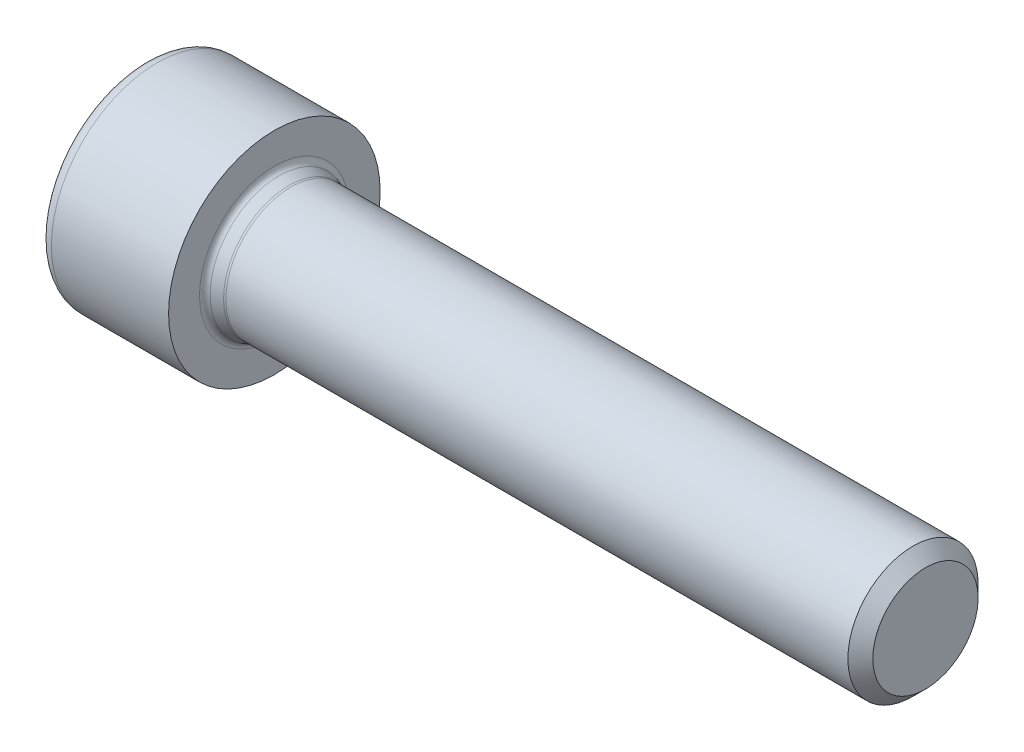
ISO-10303-21;
HEADER;
FILE_DESCRIPTION(('STEP AP214'),'2;1');
FILE_NAME('part.step','',(''),(''),'','','');
FILE_SCHEMA(('AUTOMOTIVE_DESIGN { 1 0 10303 214 1 1 1 1 }'));
ENDSEC;
DATA;
#1=APPLICATION_CONTEXT('core data for automotive mechanical design processes');
#2=APPLICATION_PROTOCOL_DEFINITION('international standard','automotive_design',2000,#1);
#3=PRODUCT_CONTEXT('',#1,'mechanical');
#4=PRODUCT('Part','Part','',(#3));
#5=PRODUCT_RELATED_PRODUCT_CATEGORY('part','',(#4));
#6=PRODUCT_DEFINITION_FORMATION('','',#4);
#7=PRODUCT_DEFINITION_CONTEXT('part definition',#1,'design');
#8=PRODUCT_DEFINITION('design','',#6,#7);
#9=PRODUCT_DEFINITION_SHAPE('','',#8);
#10=(LENGTH_UNIT() NAMED_UNIT(*) SI_UNIT(.MILLI.,.METRE.));
#11=(NAMED_UNIT(*) PLANE_ANGLE_UNIT() SI_UNIT($,.RADIAN.));
#12=(NAMED_UNIT(*) SI_UNIT($,.STERADIAN.) SOLID_ANGLE_UNIT());
#13=UNCERTAINTY_MEASURE_WITH_UNIT(LENGTH_MEASURE(1.E-05),#10,'distance_accuracy_value','');
#14=(GEOMETRIC_REPRESENTATION_CONTEXT(3) GLOBAL_UNCERTAINTY_ASSIGNED_CONTEXT((#13)) GLOBAL_UNIT_ASSIGNED_CONTEXT((#10,
#11,#12)) REPRESENTATION_CONTEXT('',''));
#15=CARTESIAN_POINT('',(0.,0.,0.));
#16=DIRECTION('',(0.,0.,1.));
#17=DIRECTION('',(1.,0.,0.));
#18=AXIS2_PLACEMENT_3D('',#15,#16,#17);
#19=CARTESIAN_POINT('',(-8.,0.,0.));
#20=DIRECTION('',(-1.,0.,0.));
#21=DIRECTION('',(0.,0.,1.));
#22=AXIS2_PLACEMENT_3D('',#19,#20,#21);
#23=CONICAL_SURFACE('',#22,3.43,0.785398163397448);
#24=CARTESIAN_POINT('',(-8.,0.,0.));
#25=DIRECTION('',(-1.,0.,0.));
#26=DIRECTION('',(0.,0.,1.));
#27=AXIS2_PLACEMENT_3D('',#24,#25,#26);
#28=CIRCLE('',#27,3.43);
#29=CARTESIAN_POINT('',(-8.,1.76667678869294,2.9400260414312));
#30=VERTEX_POINT('',#29);
#31=CARTESIAN_POINT('',(-8.,3.42947563401369,0.0599739585688037));
#32=VERTEX_POINT('',#31);
#33=EDGE_CURVE('E328',#30,#32,#28,.T.);
#34=ORIENTED_EDGE('',*,*,#33,.T.);
#35=CARTESIAN_POINT('',(-8.0002,3.42968189315209,0.0596167072615685));
#36=CARTESIAN_POINT('',(-7.94445128948551,3.37215218133699,0.15926109107012));
#37=CARTESIAN_POINT('',(-7.89213548301643,3.31368119222506,0.260535814980778));
#38=CARTESIAN_POINT('',(-7.79663457233289,3.19456786062131,0.466846157177285));
#39=CARTESIAN_POINT('',(-7.75349819621619,3.13391583501754,0.571898547104982));
#40=CARTESIAN_POINT('',(-7.67978878966847,3.01163972086899,0.783686989362354));
#41=CARTESIAN_POINT('',(-7.64904294578292,2.95004241041424,0.890376660679582));
#42=CARTESIAN_POINT('',(-7.60186435236538,2.82559002013651,1.105934523764));
#43=CARTESIAN_POINT('',(-7.58539977047203,2.76273805870714,1.21479731431503));
#44=CARTESIAN_POINT('',(-7.57052751312349,2.65273581108589,1.4053267961418));
#45=CARTESIAN_POINT('',(-7.56856676699692,2.60570135626187,1.48679286160332));
#46=CARTESIAN_POINT('',(-7.57349848669332,2.51173114393863,1.64955404374519));
#47=CARTESIAN_POINT('',(-7.58039393298158,2.46479542499364,1.7308490936477));
#48=CARTESIAN_POINT('',(-7.60264354379,2.37139103727966,1.89263023881816));
#49=CARTESIAN_POINT('',(-7.61800580231539,2.32492285881501,1.97311548485411));
#50=CARTESIAN_POINT('',(-7.65635411917835,2.23279952753145,2.13267777519974));
#51=CARTESIAN_POINT('',(-7.67933950702644,2.18714430358143,2.21175494271212));
#52=CARTESIAN_POINT('',(-7.74328762165329,2.07723451377933,2.40212428289857));
#53=CARTESIAN_POINT('',(-7.78772517421062,2.01348470492451,2.51254219080792));
#54=CARTESIAN_POINT('',(-7.86214107755692,1.91956856997231,2.67520970819563));
#55=CARTESIAN_POINT('',(-7.88819484196703,1.88859307705884,2.72886083571124));
#56=CARTESIAN_POINT('',(-7.94257244755195,1.82715678787997,2.83527160999755));
#57=CARTESIAN_POINT('',(-7.97089545456634,1.79669580742314,2.88803157579714));
#58=CARTESIAN_POINT('',(-8.00020000000014,1.7664705295544,2.94038329273868));
#59=B_SPLINE_CURVE_WITH_KNOTS('',3,(#35,#36,#37,#38,#39,#40,#41,#42,#43,#44,#45,#46,#47,#48,#49,
#50,#51,#52,#53,#54,#55,#56,#57,#58),.UNSPECIFIED.,.F.,.F.,(4,2,2,2,2,2,2,2,2,2,2,4),(0.,
0.383803741338895,0.76959666933732,1.14980534011032,1.52916434701811,1.81103145456679,
2.09299344660598,2.37522545412114,2.6574326446067,3.06181424627924,3.26340207903656,
3.4649161462977),.UNSPECIFIED.);
#60=EDGE_CURVE('E293',#32,#30,#59,.T.);
#61=ORIENTED_EDGE('',*,*,#60,.T.);
#62=EDGE_LOOP('',(#34,#61));
#63=FACE_BOUND('',#62,.T.);
#64=ADVANCED_FACE('F83',(#63),#23,.F.);
#65=CARTESIAN_POINT('',(-8.,3.42947563401369,-0.0599739585688038));
#66=VERTEX_POINT('',#65);
#67=CARTESIAN_POINT('',(-8.,1.76667678869294,-2.9400260414312));
#68=VERTEX_POINT('',#67);
#69=EDGE_CURVE('E331',#66,#68,#28,.T.);
#70=ORIENTED_EDGE('',*,*,#69,.T.);
#71=CARTESIAN_POINT('',(-8.00020000000014,1.7664705295544,-2.94038329273868));
#72=CARTESIAN_POINT('',(-7.94445128948564,1.82400024136951,-2.84073890893012));
#73=CARTESIAN_POINT('',(-7.89213548301654,1.88247123048144,-2.73946418501945));
#74=CARTESIAN_POINT('',(-7.79663457233298,2.00158456208521,-2.53315384282291));
#75=CARTESIAN_POINT('',(-7.75349819621626,2.06223658768899,-2.4281014528952));
#76=CARTESIAN_POINT('',(-7.67978878966851,2.18451270183755,-2.21631301063779));
#77=CARTESIAN_POINT('',(-7.64904294578296,2.24611001229232,-2.10962333932055));
#78=CARTESIAN_POINT('',(-7.6018643523654,2.37056240257007,-1.8940654762361));
#79=CARTESIAN_POINT('',(-7.58539977047204,2.43341436399945,-1.78520268568504));
#80=CARTESIAN_POINT('',(-7.5705275131235,2.54341661162071,-1.59467320385826));
#81=CARTESIAN_POINT('',(-7.56856676699693,2.59045106644473,-1.51320713839674));
#82=CARTESIAN_POINT('',(-7.57349848669331,2.68442127876797,-1.35044595625486));
#83=CARTESIAN_POINT('',(-7.58039393298157,2.73135699771296,-1.26915090635236));
#84=CARTESIAN_POINT('',(-7.60264354378999,2.82476138542694,-1.10736976118189));
#85=CARTESIAN_POINT('',(-7.61800580231538,2.87122956389159,-1.02688451514594));
#86=CARTESIAN_POINT('',(-7.65635411917833,2.96335289517515,-0.867322224800316));
#87=CARTESIAN_POINT('',(-7.67933950702642,3.00900811912518,-0.788245057287929));
#88=CARTESIAN_POINT('',(-7.74328762165326,3.11891790892725,-0.597875717101519));
#89=CARTESIAN_POINT('',(-7.78772517421057,3.18266771778205,-0.487457809192203));
#90=CARTESIAN_POINT('',(-7.86214107755684,3.27658385273422,-0.324790291804544));
#91=CARTESIAN_POINT('',(-7.88819484196693,3.30755934564768,-0.271139164288945));
#92=CARTESIAN_POINT('',(-7.94257244755183,3.36899563482654,-0.164728390002673));
#93=CARTESIAN_POINT('',(-7.97089545456621,3.39945661528336,-0.111968424203101));
#94=CARTESIAN_POINT('',(-8.0002,3.42968189315209,-0.0596167072615678));
#95=B_SPLINE_CURVE_WITH_KNOTS('',3,(#71,#72,#73,#74,#75,#76,#77,#78,#79,#80,#81,#82,#83,#84,#85,
#86,#87,#88,#89,#90,#91,#92,#93,#94),.UNSPECIFIED.,.F.,.F.,(4,2,2,2,2,2,2,2,2,2,2,4),(0.,
0.383803741338958,0.769596669337447,1.14980534011051,1.52916434701837,1.81103145456705,
2.09299344660624,2.3752254541214,2.65743264460696,3.06181424627937,3.26340207903663,
3.4649161462977),.UNSPECIFIED.);
#96=EDGE_CURVE('E288',#68,#66,#95,.T.);
#97=ORIENTED_EDGE('',*,*,#96,.T.);
#98=EDGE_LOOP('',(#70,#97));
#99=FACE_BOUND('',#98,.T.);
#100=ADVANCED_FACE('F319',(#99),#23,.F.);
#101=CARTESIAN_POINT('',(-8.,1.66279884532074,-3.));
#102=VERTEX_POINT('',#101);
#103=CARTESIAN_POINT('',(-8.,-1.66279884532074,-3.));
#104=VERTEX_POINT('',#103);
#105=EDGE_CURVE('E337',#102,#104,#28,.T.);
#106=ORIENTED_EDGE('',*,*,#105,.T.);
#107=CARTESIAN_POINT('',(-9.25683811666746,-3.60089593460391,-3.));
#108=CARTESIAN_POINT('',(-9.1899732652069,-3.5138467089695,-3.));
#109=CARTESIAN_POINT('',(-9.12371141227149,-3.42632688663059,-3.));
#110=CARTESIAN_POINT('',(-8.99266873176537,-3.25015426104585,-3.));
#111=CARTESIAN_POINT('',(-8.927888260097,-3.16150119334976,-3.));
#112=CARTESIAN_POINT('',(-8.79962232822234,-2.98222228828942,-3.));
#113=CARTESIAN_POINT('',(-8.73615072321782,-2.89158650554003,-3.));
#114=CARTESIAN_POINT('',(-8.61142942118204,-2.70880382260059,-3.));
#115=CARTESIAN_POINT('',(-8.55017957085525,-2.61665702730612,-3.));
#116=CARTESIAN_POINT('',(-8.42664191933515,-2.42475066596851,-3.));
#117=CARTESIAN_POINT('',(-8.3645309420549,-2.32487669679929,-3.));
#118=CARTESIAN_POINT('',(-8.24418302483278,-2.12278429752024,-3.));
#119=CARTESIAN_POINT('',(-8.18594673363496,-2.02056547864257,-3.));
#120=CARTESIAN_POINT('',(-8.07458982868164,-1.81375858148893,-3.));
#121=CARTESIAN_POINT('',(-8.02145419400034,-1.70917865511472,-3.));
#122=CARTESIAN_POINT('',(-7.92148904242748,-1.4970709738416,-3.));
#123=CARTESIAN_POINT('',(-7.8746565605369,-1.38954463378653,-3.));
#124=CARTESIAN_POINT('',(-7.79315666520408,-1.18192230353124,-3.));
#125=CARTESIAN_POINT('',(-7.75774932375754,-1.08211975122954,-3.));
#126=CARTESIAN_POINT('',(-7.69492443851392,-0.879983721132287,-3.));
#127=CARTESIAN_POINT('',(-7.66750740683301,-0.777650081569711,-3.));
#128=CARTESIAN_POINT('',(-7.62259948527455,-0.572838321795489,-3.));
#129=CARTESIAN_POINT('',(-7.60492919530609,-0.470400208079424,-3.));
#130=CARTESIAN_POINT('',(-7.579881374429,-0.264266267330525,-3.));
#131=CARTESIAN_POINT('',(-7.57250174135376,-0.160570701535941,-3.));
#132=CARTESIAN_POINT('',(-7.56865707718844,0.0425589692299217,-3.));
#133=CARTESIAN_POINT('',(-7.57173626178567,0.141984537989483,-3.));
#134=CARTESIAN_POINT('',(-7.58759599253369,0.340053623390843,-3.));
#135=CARTESIAN_POINT('',(-7.60037742551248,0.438697067710168,-3.));
#136=CARTESIAN_POINT('',(-7.63513837273016,0.636159304889223,-3.));
#137=CARTESIAN_POINT('',(-7.65727977296236,0.734949114878743,-3.));
#138=CARTESIAN_POINT('',(-7.70953635508266,0.930355391005281,-3.));
#139=CARTESIAN_POINT('',(-7.73965106524348,1.02697198535012,-3.));
#140=CARTESIAN_POINT('',(-7.8085615039976,1.22363203683084,-3.));
#141=CARTESIAN_POINT('',(-7.84777278223078,1.32352823240013,-3.));
#142=CARTESIAN_POINT('',(-7.93224534094475,1.52073629110562,-3.));
#143=CARTESIAN_POINT('',(-7.97750856914324,1.61804731011014,-3.));
#144=CARTESIAN_POINT('',(-8.07301916941846,1.81056665192493,-3.));
#145=CARTESIAN_POINT('',(-8.12328227557948,1.90576710512834,-3.));
#146=CARTESIAN_POINT('',(-8.22768211012451,2.09398380875647,-3.));
#147=CARTESIAN_POINT('',(-8.28181815601638,2.18700044019744,-3.));
#148=CARTESIAN_POINT('',(-8.39045717895091,2.36658990741689,-3.));
#149=CARTESIAN_POINT('',(-8.44480995173043,2.45325408876517,-3.));
#150=CARTESIAN_POINT('',(-8.55582709985423,2.6250935615464,-3.));
#151=CARTESIAN_POINT('',(-8.6124916486565,2.71026874056854,-3.));
#152=CARTESIAN_POINT('',(-8.72725822960812,2.87863975740492,-3.));
#153=CARTESIAN_POINT('',(-8.78534505080608,2.96184600084624,-3.));
#154=CARTESIAN_POINT('',(-8.9030743415102,3.12711730435875,-3.));
#155=CARTESIAN_POINT('',(-8.9627163778154,3.20918267265618,-3.));
#156=CARTESIAN_POINT('',(-9.0229949516808,3.29076952090156,-3.));
#157=B_SPLINE_CURVE_WITH_KNOTS('',3,(#107,#108,#109,#110,#111,#112,#113,#114,#115,#116,#117,
#118,#119,#120,#121,#122,#123,#124,#125,#126,#127,#128,#129,#130,#131,#132,#133,#134,#135,#136,
#137,#138,#139,#140,#141,#142,#143,#144,#145,#146,#147,#148,#149,#150,#151,#152,#153,#154,#155,
#156),.UNSPECIFIED.,.F.,.F.,(4,2,2,2,2,2,2,2,2,2,2,2,2,2,2,2,2,2,2,2,2,2,2,2,4),(0.,
0.329302731842327,0.658683764795409,0.99060717455276,1.32250763869058,1.67527376182026,
2.02809880120335,2.37985069947165,2.73143655121112,3.04885409798105,3.36629198425407,
3.67767349965861,3.98899139699043,4.28691955486206,4.58487494795206,4.8882092833539,
5.19152567650533,5.51322738298347,5.83503287404874,6.15788517368226,6.48068071953801,
6.78753206182661,7.09440647038974,7.39881482419977,7.70313927304357),.UNSPECIFIED.);
#158=EDGE_CURVE('E282',#104,#102,#157,.T.);
#159=ORIENTED_EDGE('',*,*,#158,.T.);
#160=EDGE_LOOP('',(#106,#159));
#161=FACE_BOUND('',#160,.T.);
#162=ADVANCED_FACE('F324',(#161),#23,.F.);
#163=CARTESIAN_POINT('',(-8.,-1.76667678869294,-2.9400260414312));
#164=VERTEX_POINT('',#163);
#165=CARTESIAN_POINT('',(-8.,-3.42947563401369,-0.0599739585688037));
#166=VERTEX_POINT('',#165);
#167=EDGE_CURVE('E344',#164,#166,#28,.T.);
#168=ORIENTED_EDGE('',*,*,#167,.T.);
#169=CARTESIAN_POINT('',(-8.0002,-3.42968189315209,-0.0596167072615685));
#170=CARTESIAN_POINT('',(-7.94445128948551,-3.37215218133699,-0.15926109107012));
#171=CARTESIAN_POINT('',(-7.89213548301643,-3.31368119222506,-0.260535814980778));
#172=CARTESIAN_POINT('',(-7.79663457233289,-3.19456786062131,-0.466846157177285));
#173=CARTESIAN_POINT('',(-7.75349819621619,-3.13391583501754,-0.571898547104982));
#174=CARTESIAN_POINT('',(-7.67978878966847,-3.01163972086899,-0.783686989362354));
#175=CARTESIAN_POINT('',(-7.64904294578292,-2.95004241041424,-0.890376660679582));
#176=CARTESIAN_POINT('',(-7.60186435236538,-2.82559002013651,-1.105934523764));
#177=CARTESIAN_POINT('',(-7.58539977047203,-2.76273805870714,-1.21479731431503));
#178=CARTESIAN_POINT('',(-7.57052751312349,-2.65273581108589,-1.4053267961418));
#179=CARTESIAN_POINT('',(-7.56856676699692,-2.60570135626187,-1.48679286160332));
#180=CARTESIAN_POINT('',(-7.57349848669332,-2.51173114393863,-1.64955404374519));
#181=CARTESIAN_POINT('',(-7.58039393298158,-2.46479542499364,-1.7308490936477));
#182=CARTESIAN_POINT('',(-7.60264354379,-2.37139103727966,-1.89263023881816));
#183=CARTESIAN_POINT('',(-7.61800580231539,-2.32492285881501,-1.97311548485411));
#184=CARTESIAN_POINT('',(-7.65635411917835,-2.23279952753145,-2.13267777519974));
#185=CARTESIAN_POINT('',(-7.67933950702644,-2.18714430358143,-2.21175494271212));
#186=CARTESIAN_POINT('',(-7.74328762165329,-2.07723451377933,-2.40212428289857));
#187=CARTESIAN_POINT('',(-7.78772517421062,-2.01348470492451,-2.51254219080792));
#188=CARTESIAN_POINT('',(-7.86214107755692,-1.91956856997231,-2.67520970819563));
#189=CARTESIAN_POINT('',(-7.88819484196703,-1.88859307705884,-2.72886083571124));
#190=CARTESIAN_POINT('',(-7.94257244755195,-1.82715678787997,-2.83527160999755));
#191=CARTESIAN_POINT('',(-7.97089545456634,-1.79669580742314,-2.88803157579714));
#192=CARTESIAN_POINT('',(-8.00020000000014,-1.7664705295544,-2.94038329273868));
#193=B_SPLINE_CURVE_WITH_KNOTS('',3,(#169,#170,#171,#172,#173,#174,#175,#176,#177,#178,#179,
#180,#181,#182,#183,#184,#185,#186,#187,#188,#189,#190,#191,#192),.UNSPECIFIED.,.F.,.F.,(4,2,2,
2,2,2,2,2,2,2,2,4),(0.,0.383803741338895,0.76959666933732,1.14980534011032,1.52916434701811,
1.81103145456679,2.09299344660598,2.37522545412114,2.6574326446067,3.06181424627924,
3.26340207903656,3.4649161462977),.UNSPECIFIED.);
#194=EDGE_CURVE('E276',#166,#164,#193,.T.);
#195=ORIENTED_EDGE('',*,*,#194,.T.);
#196=EDGE_LOOP('',(#168,#195));
#197=FACE_BOUND('',#196,.T.);
#198=ADVANCED_FACE('F511',(#197),#23,.F.);
#199=CARTESIAN_POINT('',(-8.,-3.42947563401369,0.0599739585688032));
#200=VERTEX_POINT('',#199);
#201=CARTESIAN_POINT('',(-8.,-1.76667678869294,2.9400260414312));
#202=VERTEX_POINT('',#201);
#203=EDGE_CURVE('E340',#200,#202,#28,.T.);
#204=ORIENTED_EDGE('',*,*,#203,.T.);
#205=CARTESIAN_POINT('',(-8.00020000000014,-1.7664705295544,2.94038329273868));
#206=CARTESIAN_POINT('',(-7.94445128948564,-1.82400024136951,2.84073890893012));
#207=CARTESIAN_POINT('',(-7.89213548301654,-1.88247123048144,2.73946418501945));
#208=CARTESIAN_POINT('',(-7.79663457233298,-2.00158456208521,2.53315384282291));
#209=CARTESIAN_POINT('',(-7.75349819621626,-2.06223658768899,2.4281014528952));
#210=CARTESIAN_POINT('',(-7.67978878966851,-2.18451270183755,2.21631301063779));
#211=CARTESIAN_POINT('',(-7.64904294578296,-2.24611001229232,2.10962333932055));
#212=CARTESIAN_POINT('',(-7.6018643523654,-2.37056240257007,1.8940654762361));
#213=CARTESIAN_POINT('',(-7.58539977047204,-2.43341436399945,1.78520268568504));
#214=CARTESIAN_POINT('',(-7.5705275131235,-2.54341661162071,1.59467320385826));
#215=CARTESIAN_POINT('',(-7.56856676699693,-2.59045106644473,1.51320713839674));
#216=CARTESIAN_POINT('',(-7.57349848669331,-2.68442127876797,1.35044595625486));
#217=CARTESIAN_POINT('',(-7.58039393298157,-2.73135699771296,1.26915090635236));
#218=CARTESIAN_POINT('',(-7.60264354378999,-2.82476138542694,1.10736976118189));
#219=CARTESIAN_POINT('',(-7.61800580231538,-2.87122956389159,1.02688451514594));
#220=CARTESIAN_POINT('',(-7.65635411917833,-2.96335289517515,0.867322224800316));
#221=CARTESIAN_POINT('',(-7.67933950702642,-3.00900811912518,0.788245057287929));
#222=CARTESIAN_POINT('',(-7.74328762165326,-3.11891790892725,0.597875717101519));
#223=CARTESIAN_POINT('',(-7.78772517421057,-3.18266771778205,0.487457809192203));
#224=CARTESIAN_POINT('',(-7.86214107755684,-3.27658385273422,0.324790291804544));
#225=CARTESIAN_POINT('',(-7.88819484196693,-3.30755934564768,0.271139164288945));
#226=CARTESIAN_POINT('',(-7.94257244755183,-3.36899563482654,0.164728390002673));
#227=CARTESIAN_POINT('',(-7.97089545456621,-3.39945661528336,0.111968424203101));
#228=CARTESIAN_POINT('',(-8.0002,-3.42968189315209,0.0596167072615678));
#229=B_SPLINE_CURVE_WITH_KNOTS('',3,(#205,#206,#207,#208,#209,#210,#211,#212,#213,#214,#215,
#216,#217,#218,#219,#220,#221,#222,#223,#224,#225,#226,#227,#228),.UNSPECIFIED.,.F.,.F.,(4,2,2,
2,2,2,2,2,2,2,2,4),(0.,0.383803741338958,0.769596669337447,1.14980534011051,1.52916434701837,
1.81103145456705,2.09299344660624,2.3752254541214,2.65743264460696,3.06181424627937,
3.26340207903663,3.4649161462977),.UNSPECIFIED.);
#230=EDGE_CURVE('E254',#202,#200,#229,.T.);
#231=ORIENTED_EDGE('',*,*,#230,.T.);
#232=EDGE_LOOP('',(#204,#231));
#233=FACE_BOUND('',#232,.T.);
#234=ADVANCED_FACE('F267',(#233),#23,.F.);
#235=CARTESIAN_POINT('',(-8.,-1.66279884532074,3.));
#236=VERTEX_POINT('',#235);
#237=CARTESIAN_POINT('',(-8.,1.66279884532074,3.));
#238=VERTEX_POINT('',#237);
#239=EDGE_CURVE('E333',#236,#238,#28,.T.);
#240=ORIENTED_EDGE('',*,*,#239,.T.);
#241=CARTESIAN_POINT('',(-9.25683811666746,-3.60089593460391,3.));
#242=CARTESIAN_POINT('',(-9.1899732652069,-3.5138467089695,3.));
#243=CARTESIAN_POINT('',(-9.12371141227149,-3.42632688663059,3.));
#244=CARTESIAN_POINT('',(-8.99266873176537,-3.25015426104585,3.));
#245=CARTESIAN_POINT('',(-8.927888260097,-3.16150119334976,3.));
#246=CARTESIAN_POINT('',(-8.79962232822234,-2.98222228828942,3.));
#247=CARTESIAN_POINT('',(-8.73615072321782,-2.89158650554003,3.));
#248=CARTESIAN_POINT('',(-8.61142942118204,-2.70880382260059,3.));
#249=CARTESIAN_POINT('',(-8.55017957085525,-2.61665702730612,3.));
#250=CARTESIAN_POINT('',(-8.42664191933515,-2.42475066596851,3.));
#251=CARTESIAN_POINT('',(-8.3645309420549,-2.32487669679929,3.));
#252=CARTESIAN_POINT('',(-8.24418302483278,-2.12278429752024,3.));
#253=CARTESIAN_POINT('',(-8.18594673363496,-2.02056547864257,3.));
#254=CARTESIAN_POINT('',(-8.07458982868164,-1.81375858148893,3.));
#255=CARTESIAN_POINT('',(-8.02145419400034,-1.70917865511472,3.));
#256=CARTESIAN_POINT('',(-7.92148904242748,-1.4970709738416,3.));
#257=CARTESIAN_POINT('',(-7.8746565605369,-1.38954463378653,3.));
#258=CARTESIAN_POINT('',(-7.79315666520408,-1.18192230353124,3.));
#259=CARTESIAN_POINT('',(-7.75774932375754,-1.08211975122954,3.));
#260=CARTESIAN_POINT('',(-7.69492443851392,-0.879983721132287,3.));
#261=CARTESIAN_POINT('',(-7.66750740683301,-0.777650081569711,3.));
#262=CARTESIAN_POINT('',(-7.62259948527455,-0.572838321795489,3.));
#263=CARTESIAN_POINT('',(-7.60492919530609,-0.470400208079424,3.));
#264=CARTESIAN_POINT('',(-7.579881374429,-0.264266267330525,3.));
#265=CARTESIAN_POINT('',(-7.57250174135376,-0.160570701535941,3.));
#266=CARTESIAN_POINT('',(-7.56865707718844,0.0425589692299217,3.));
#267=CARTESIAN_POINT('',(-7.57173626178567,0.141984537989483,3.));
#268=CARTESIAN_POINT('',(-7.58759599253369,0.340053623390843,3.));
#269=CARTESIAN_POINT('',(-7.60037742551248,0.438697067710168,3.));
#270=CARTESIAN_POINT('',(-7.63513837273016,0.636159304889223,3.));
#271=CARTESIAN_POINT('',(-7.65727977296236,0.734949114878743,3.));
#272=CARTESIAN_POINT('',(-7.70953635508266,0.930355391005281,3.));
#273=CARTESIAN_POINT('',(-7.73965106524348,1.02697198535012,3.));
#274=CARTESIAN_POINT('',(-7.8085615039976,1.22363203683084,3.));
#275=CARTESIAN_POINT('',(-7.84777278223078,1.32352823240013,3.));
#276=CARTESIAN_POINT('',(-7.93224534094475,1.52073629110562,3.));
#277=CARTESIAN_POINT('',(-7.97750856914324,1.61804731011014,3.));
#278=CARTESIAN_POINT('',(-8.07301916941846,1.81056665192493,3.));
#279=CARTESIAN_POINT('',(-8.12328227557948,1.90576710512834,3.));
#280=CARTESIAN_POINT('',(-8.22768211012451,2.09398380875647,3.));
#281=CARTESIAN_POINT('',(-8.28181815601638,2.18700044019744,3.));
#282=CARTESIAN_POINT('',(-8.39045717895091,2.36658990741689,3.));
#283=CARTESIAN_POINT('',(-8.44480995173043,2.45325408876517,3.));
#284=CARTESIAN_POINT('',(-8.55582709985423,2.6250935615464,3.));
#285=CARTESIAN_POINT('',(-8.6124916486565,2.71026874056854,3.));
#286=CARTESIAN_POINT('',(-8.72725822960812,2.87863975740492,3.));
#287=CARTESIAN_POINT('',(-8.78534505080608,2.96184600084624,3.));
#288=CARTESIAN_POINT('',(-8.9030743415102,3.12711730435875,3.));
#289=CARTESIAN_POINT('',(-8.9627163778154,3.20918267265618,3.));
#290=CARTESIAN_POINT('',(-9.0229949516808,3.29076952090156,3.));
#291=B_SPLINE_CURVE_WITH_KNOTS('',3,(#241,#242,#243,#244,#245,#246,#247,#248,#249,#250,#251,
#252,#253,#254,#255,#256,#257,#258,#259,#260,#261,#262,#263,#264,#265,#266,#267,#268,#269,#270,
#271,#272,#273,#274,#275,#276,#277,#278,#279,#280,#281,#282,#283,#284,#285,#286,#287,#288,#289,
#290),.UNSPECIFIED.,.F.,.F.,(4,2,2,2,2,2,2,2,2,2,2,2,2,2,2,2,2,2,2,2,2,2,2,2,4),(0.,
0.329302731842327,0.658683764795409,0.99060717455276,1.32250763869058,1.67527376182026,
2.02809880120335,2.37985069947165,2.73143655121112,3.04885409798105,3.36629198425407,
3.67767349965861,3.98899139699043,4.28691955486206,4.58487494795206,4.8882092833539,
5.19152567650533,5.51322738298347,5.83503287404874,6.15788517368226,6.48068071953801,
6.78753206182661,7.09440647038974,7.39881482419977,7.70313927304357),.UNSPECIFIED.);
#292=EDGE_CURVE('E241',#238,#236,#291,.F.);
#293=ORIENTED_EDGE('',*,*,#292,.T.);
#294=EDGE_LOOP('',(#240,#293));
#295=FACE_BOUND('',#294,.T.);
#296=ADVANCED_FACE('F262',(#295),#23,.F.);
#297=CARTESIAN_POINT('',(-8.,0.,-3.43));
#298=DIRECTION('',(1.,0.,0.));
#299=DIRECTION('',(0.,0.,-1.));
#300=AXIS2_PLACEMENT_3D('',#297,#298,#299);
#301=PLANE('',#300);
#302=DIRECTION('',(0.,0.5,0.866025403784439));
#303=VECTOR('',#302,1.);
#304=CARTESIAN_POINT('',(-8.,1.112842643863,-4.0725));
#305=LINE('',#304,#303);
#306=CARTESIAN_POINT('',(-8.,3.46410161513775,0.));
#307=VERTEX_POINT('',#306);
#308=EDGE_CURVE('E92',#66,#307,#305,.T.);
#309=ORIENTED_EDGE('',*,*,#308,.T.);
#310=DIRECTION('',(0.,-0.5,0.866025403784439));
#311=VECTOR('',#310,1.);
#312=CARTESIAN_POINT('',(-8.,4.08330977884363,-1.0725));
#313=LINE('',#312,#311);
#314=EDGE_CURVE('E47',#307,#32,#313,.T.);
#315=ORIENTED_EDGE('',*,*,#314,.T.);
#316=ORIENTED_EDGE('',*,*,#33,.F.);
#317=CARTESIAN_POINT('',(-8.,1.73205080756888,3.));
#318=VERTEX_POINT('',#317);
#319=EDGE_CURVE('E94',#30,#318,#313,.T.);
#320=ORIENTED_EDGE('',*,*,#319,.T.);
#321=DIRECTION('',(0.,-1.,0.));
#322=VECTOR('',#321,1.);
#323=CARTESIAN_POINT('',(-8.,0.,3.));
#324=LINE('',#323,#322);
#325=EDGE_CURVE('E216',#318,#238,#324,.T.);
#326=ORIENTED_EDGE('',*,*,#325,.T.);
#327=ORIENTED_EDGE('',*,*,#239,.F.);
#328=CARTESIAN_POINT('',(-8.,-1.73205080756888,3.));
#329=VERTEX_POINT('',#328);
#330=EDGE_CURVE('E454',#236,#329,#324,.T.);
#331=ORIENTED_EDGE('',*,*,#330,.T.);
#332=DIRECTION('',(0.,-0.5,-0.866025403784439));
#333=VECTOR('',#332,1.);
#334=CARTESIAN_POINT('',(-8.,-4.08330977884363,-1.0725));
#335=LINE('',#334,#333);
#336=EDGE_CURVE('E451',#329,#202,#335,.T.);
#337=ORIENTED_EDGE('',*,*,#336,.T.);
#338=ORIENTED_EDGE('',*,*,#203,.F.);
#339=CARTESIAN_POINT('',(-8.,-3.46410161513775,0.));
#340=VERTEX_POINT('',#339);
#341=EDGE_CURVE('E449',#200,#340,#335,.T.);
#342=ORIENTED_EDGE('',*,*,#341,.T.);
#343=DIRECTION('',(0.,0.5,-0.866025403784439));
#344=VECTOR('',#343,1.);
#345=CARTESIAN_POINT('',(-8.,-1.112842643863,-4.0725));
#346=LINE('',#345,#344);
#347=EDGE_CURVE('E447',#340,#166,#346,.T.);
#348=ORIENTED_EDGE('',*,*,#347,.T.);
#349=ORIENTED_EDGE('',*,*,#167,.F.);
#350=CARTESIAN_POINT('',(-8.,-1.73205080756888,-3.));
#351=VERTEX_POINT('',#350);
#352=EDGE_CURVE('E445',#164,#351,#346,.T.);
#353=ORIENTED_EDGE('',*,*,#352,.T.);
#354=DIRECTION('',(0.,1.,0.));
#355=VECTOR('',#354,1.);
#356=CARTESIAN_POINT('',(-8.,0.,-3.));
#357=LINE('',#356,#355);
#358=EDGE_CURVE('E441',#351,#104,#357,.T.);
#359=ORIENTED_EDGE('',*,*,#358,.T.);
#360=ORIENTED_EDGE('',*,*,#105,.F.);
#361=CARTESIAN_POINT('',(-8.,1.73205080756888,-3.));
#362=VERTEX_POINT('',#361);
#363=EDGE_CURVE('E439',#102,#362,#357,.T.);
#364=ORIENTED_EDGE('',*,*,#363,.T.);
#365=EDGE_CURVE('E87',#362,#68,#305,.T.);
#366=ORIENTED_EDGE('',*,*,#365,.T.);
#367=ORIENTED_EDGE('',*,*,#69,.F.);
#368=EDGE_LOOP('',(#309,#315,#316,#320,#326,#327,#331,#337,#338,#342,#348,#349,#353,#359,#360,
#364,#366,#367));
#369=FACE_BOUND('',#368,.T.);
#370=CARTESIAN_POINT('',(-8.,0.,0.));
#371=DIRECTION('',(-1.,0.,0.));
#372=DIRECTION('',(0.,0.,1.));
#373=AXIS2_PLACEMENT_3D('',#370,#371,#372);
#374=CIRCLE('',#373,5.7);
#375=CARTESIAN_POINT('',(-8.,0.,5.7));
#376=VERTEX_POINT('',#375);
#377=EDGE_CURVE('E341',#376,#376,#374,.T.);
#378=ORIENTED_EDGE('',*,*,#377,.T.);
#379=EDGE_LOOP('',(#378));
#380=FACE_BOUND('',#379,.T.);
#381=ADVANCED_FACE('F266',(#369,#380),#301,.F.);
#382=CARTESIAN_POINT('',(-7.20000000000001,0.,0.));
#383=DIRECTION('',(-1.,0.,0.));
#384=DIRECTION('',(0.,0.,1.));
#385=AXIS2_PLACEMENT_3D('',#382,#383,#384);
#386=TOROIDAL_SURFACE('',#385,5.70000000000001,0.799999999999994);
#387=ORIENTED_EDGE('',*,*,#377,.F.);
#388=EDGE_LOOP('',(#387));
#389=FACE_BOUND('',#388,.T.);
#390=CARTESIAN_POINT('',(-7.2,0.,0.));
#391=DIRECTION('',(-1.,0.,0.));
#392=DIRECTION('',(0.,0.,1.));
#393=AXIS2_PLACEMENT_3D('',#390,#391,#392);
#394=CIRCLE('',#393,6.5);
#395=CARTESIAN_POINT('',(-7.2,0.,6.5));
#396=VERTEX_POINT('',#395);
#397=EDGE_CURVE('E346',#396,#396,#394,.T.);
#398=ORIENTED_EDGE('',*,*,#397,.T.);
#399=EDGE_LOOP('',(#398));
#400=FACE_BOUND('',#399,.T.);
#401=ADVANCED_FACE('F411',(#389,#400),#386,.T.);
#402=CARTESIAN_POINT('',(43.,0.,0.));
#403=DIRECTION('',(-1.,0.,0.));
#404=DIRECTION('',(0.,0.,1.));
#405=AXIS2_PLACEMENT_3D('',#402,#403,#404);
#406=CYLINDRICAL_SURFACE('',#405,6.5);
#407=ORIENTED_EDGE('',*,*,#397,.F.);
#408=EDGE_LOOP('',(#407));
#409=FACE_BOUND('',#408,.T.);
#410=CARTESIAN_POINT('',(0.,0.,0.));
#411=DIRECTION('',(-1.,0.,0.));
#412=DIRECTION('',(0.,0.,1.));
#413=AXIS2_PLACEMENT_3D('',#410,#411,#412);
#414=CIRCLE('',#413,6.5);
#415=CARTESIAN_POINT('',(0.,0.,6.5));
#416=VERTEX_POINT('',#415);
#417=EDGE_CURVE('E350',#416,#416,#414,.T.);
#418=ORIENTED_EDGE('',*,*,#417,.T.);
#419=EDGE_LOOP('',(#418));
#420=FACE_BOUND('',#419,.T.);
#421=ADVANCED_FACE('F408',(#409,#420),#406,.T.);
#422=CARTESIAN_POINT('',(0.,0.,-6.5));
#423=DIRECTION('',(-1.,0.,0.));
#424=DIRECTION('',(0.,0.,1.));
#425=AXIS2_PLACEMENT_3D('',#422,#423,#424);
#426=PLANE('',#425);
#427=ORIENTED_EDGE('',*,*,#417,.F.);
#428=EDGE_LOOP('',(#427));
#429=FACE_BOUND('',#428,.T.);
#430=CARTESIAN_POINT('',(0.,0.,0.));
#431=DIRECTION('',(-1.,0.,0.));
#432=DIRECTION('',(0.,0.,1.));
#433=AXIS2_PLACEMENT_3D('',#430,#431,#432);
#434=CIRCLE('',#433,4.6);
#435=CARTESIAN_POINT('',(0.,0.,4.6));
#436=VERTEX_POINT('',#435);
#437=EDGE_CURVE('E355',#436,#436,#434,.T.);
#438=ORIENTED_EDGE('',*,*,#437,.T.);
#439=EDGE_LOOP('',(#438));
#440=FACE_BOUND('',#439,.T.);
#441=ADVANCED_FACE('F404',(#429,#440),#426,.F.);
#442=CARTESIAN_POINT('',(0.399999999999998,0.,0.));
#443=DIRECTION('',(-1.,0.,0.));
#444=DIRECTION('',(0.,0.,1.));
#445=AXIS2_PLACEMENT_3D('',#442,#443,#444);
#446=TOROIDAL_SURFACE('',#445,4.6,0.399999999999998);
#447=ORIENTED_EDGE('',*,*,#437,.F.);
#448=EDGE_LOOP('',(#447));
#449=FACE_BOUND('',#448,.T.);
#450=CARTESIAN_POINT('',(0.277198888030898,0.,0.));
#451=DIRECTION('',(-1.,0.,0.));
#452=DIRECTION('',(0.,0.,1.));
#453=AXIS2_PLACEMENT_3D('',#450,#451,#452);
#454=CIRCLE('',#453,4.21931655289578);
#455=CARTESIAN_POINT('',(0.277198888030898,0.,4.21931655289578));
#456=VERTEX_POINT('',#455);
#457=EDGE_CURVE('E358',#456,#456,#454,.T.);
#458=ORIENTED_EDGE('',*,*,#457,.T.);
#459=EDGE_LOOP('',(#458));
#460=FACE_BOUND('',#459,.T.);
#461=ADVANCED_FACE('F400',(#449,#460),#446,.F.);
#462=CARTESIAN_POINT('',(0.897198888030894,0.,0.));
#463=DIRECTION('',(-1.,0.,0.));
#464=DIRECTION('',(0.,0.,1.));
#465=AXIS2_PLACEMENT_3D('',#462,#463,#464);
#466=CONICAL_SURFACE('',#465,4.01931655289578,0.312042121562537);
#467=ORIENTED_EDGE('',*,*,#457,.F.);
#468=EDGE_LOOP('',(#467));
#469=FACE_BOUND('',#468,.T.);
#470=CARTESIAN_POINT('',(0.897198888030894,0.,0.));
#471=DIRECTION('',(-1.,0.,0.));
#472=DIRECTION('',(0.,0.,1.));
#473=AXIS2_PLACEMENT_3D('',#470,#471,#472);
#474=CIRCLE('',#473,4.01931655289578);
#475=CARTESIAN_POINT('',(0.897198888030894,0.,4.01931655289578));
#476=VERTEX_POINT('',#475);
#477=EDGE_CURVE('E361',#476,#476,#474,.T.);
#478=ORIENTED_EDGE('',*,*,#477,.T.);
#479=EDGE_LOOP('',(#478));
#480=FACE_BOUND('',#479,.T.);
#481=ADVANCED_FACE('F396',(#469,#480),#466,.T.);
#482=CARTESIAN_POINT('',(1.01999999999999,0.,0.));
#483=DIRECTION('',(-1.,0.,0.));
#484=DIRECTION('',(0.,0.,1.));
#485=AXIS2_PLACEMENT_3D('',#482,#483,#484);
#486=TOROIDAL_SURFACE('',#485,4.39999999999995,0.399999999999954);
#487=ORIENTED_EDGE('',*,*,#477,.F.);
#488=EDGE_LOOP('',(#487));
#489=FACE_BOUND('',#488,.T.);
#490=CARTESIAN_POINT('',(1.02,0.,0.));
#491=DIRECTION('',(-1.,0.,0.));
#492=DIRECTION('',(0.,0.,1.));
#493=AXIS2_PLACEMENT_3D('',#490,#491,#492);
#494=CIRCLE('',#493,4.);
#495=CARTESIAN_POINT('',(1.02,0.,4.));
#496=VERTEX_POINT('',#495);
#497=EDGE_CURVE('E364',#496,#496,#494,.T.);
#498=ORIENTED_EDGE('',*,*,#497,.T.);
#499=EDGE_LOOP('',(#498));
#500=FACE_BOUND('',#499,.T.);
#501=ADVANCED_FACE('F392',(#489,#500),#486,.F.);
#502=CARTESIAN_POINT('',(43.,0.,0.));
#503=DIRECTION('',(-1.,0.,0.));
#504=DIRECTION('',(0.,0.,1.));
#505=AXIS2_PLACEMENT_3D('',#502,#503,#504);
#506=CYLINDRICAL_SURFACE('',#505,4.);
#507=ORIENTED_EDGE('',*,*,#497,.F.);
#508=EDGE_LOOP('',(#507));
#509=FACE_BOUND('',#508,.T.);
#510=CARTESIAN_POINT('',(39.233,0.,0.));
#511=DIRECTION('',(-1.,0.,0.));
#512=DIRECTION('',(0.,0.,1.));
#513=AXIS2_PLACEMENT_3D('',#510,#511,#512);
#514=CIRCLE('',#513,4.);
#515=CARTESIAN_POINT('',(39.233,0.,4.));
#516=VERTEX_POINT('',#515);
#517=EDGE_CURVE('E367',#516,#516,#514,.T.);
#518=ORIENTED_EDGE('',*,*,#517,.T.);
#519=EDGE_LOOP('',(#518));
#520=FACE_BOUND('',#519,.T.);
#521=ADVANCED_FACE('F385',(#509,#520),#506,.T.);
#522=CARTESIAN_POINT('',(40.,0.,0.));
#523=DIRECTION('',(-1.,0.,0.));
#524=DIRECTION('',(0.,0.,1.));
#525=AXIS2_PLACEMENT_3D('',#522,#523,#524);
#526=CONICAL_SURFACE('',#525,3.233,0.785398163397451);
#527=ORIENTED_EDGE('',*,*,#517,.F.);
#528=EDGE_LOOP('',(#527));
#529=FACE_BOUND('',#528,.T.);
#530=CARTESIAN_POINT('',(40.,0.,0.));
#531=DIRECTION('',(-1.,0.,0.));
#532=DIRECTION('',(0.,0.,1.));
#533=AXIS2_PLACEMENT_3D('',#530,#531,#532);
#534=CIRCLE('',#533,3.233);
#535=CARTESIAN_POINT('',(40.,0.,3.233));
#536=VERTEX_POINT('',#535);
#537=EDGE_CURVE('E369',#536,#536,#534,.T.);
#538=ORIENTED_EDGE('',*,*,#537,.T.);
#539=EDGE_LOOP('',(#538));
#540=FACE_BOUND('',#539,.T.);
#541=ADVANCED_FACE('F373',(#529,#540),#526,.T.);
#542=CARTESIAN_POINT('',(40.,0.,-3.233));
#543=DIRECTION('',(-1.,0.,0.));
#544=DIRECTION('',(0.,0.,1.));
#545=AXIS2_PLACEMENT_3D('',#542,#543,#544);
#546=PLANE('',#545);
#547=ORIENTED_EDGE('',*,*,#537,.F.);
#548=EDGE_LOOP('',(#547));
#549=FACE_BOUND('',#548,.T.);
#550=ADVANCED_FACE('F375',(#549),#546,.F.);
#551=CARTESIAN_POINT('',(-3.3,1.73205080756888,3.));
#552=DIRECTION('',(1.,0.,0.));
#553=DIRECTION('',(0.,0.,-1.));
#554=AXIS2_PLACEMENT_3D('',#551,#552,#553);
#555=PLANE('',#554);
#556=DIRECTION('',(0.,1.,0.));
#557=VECTOR('',#556,1.);
#558=CARTESIAN_POINT('',(-3.3,-1.73205080756888,-3.));
#559=LINE('',#558,#557);
#560=CARTESIAN_POINT('',(-3.3,-1.73205080756888,-3.));
#561=VERTEX_POINT('',#560);
#562=CARTESIAN_POINT('',(-3.3,0.,-3.));
#563=VERTEX_POINT('',#562);
#564=EDGE_CURVE('E101',#561,#563,#559,.T.);
#565=ORIENTED_EDGE('',*,*,#564,.F.);
#566=DIRECTION('',(0.,0.5,-0.866025403784439));
#567=VECTOR('',#566,1.);
#568=CARTESIAN_POINT('',(-3.3,-3.46410161513775,0.));
#569=LINE('',#568,#567);
#570=CARTESIAN_POINT('',(-3.3,-2.59807621135332,-1.5));
#571=VERTEX_POINT('',#570);
#572=EDGE_CURVE('E230',#571,#561,#569,.T.);
#573=ORIENTED_EDGE('',*,*,#572,.F.);
#574=CARTESIAN_POINT('',(-3.3,0.,0.));
#575=DIRECTION('',(-1.,0.,0.));
#576=DIRECTION('',(0.,0.,1.));
#577=AXIS2_PLACEMENT_3D('',#574,#575,#576);
#578=CIRCLE('',#577,3.);
#579=EDGE_CURVE('E461',#563,#571,#578,.T.);
#580=ORIENTED_EDGE('',*,*,#579,.F.);
#581=EDGE_LOOP('',(#565,#573,#580));
#582=FACE_BOUND('',#581,.T.);
#583=ADVANCED_FACE('F304',(#582),#555,.F.);
#584=CARTESIAN_POINT('',(-3.3,-3.46410161513775,0.));
#585=VERTEX_POINT('',#584);
#586=EDGE_CURVE('E231',#585,#571,#569,.T.);
#587=ORIENTED_EDGE('',*,*,#586,.F.);
#588=DIRECTION('',(0.,-0.5,-0.866025403784439));
#589=VECTOR('',#588,1.);
#590=CARTESIAN_POINT('',(-3.3,-1.73205080756888,3.));
#591=LINE('',#590,#589);
#592=CARTESIAN_POINT('',(-3.3,-2.59807621135332,1.5));
#593=VERTEX_POINT('',#592);
#594=EDGE_CURVE('E222',#593,#585,#591,.T.);
#595=ORIENTED_EDGE('',*,*,#594,.F.);
#596=EDGE_CURVE('E334',#571,#593,#578,.T.);
#597=ORIENTED_EDGE('',*,*,#596,.F.);
#598=EDGE_LOOP('',(#587,#595,#597));
#599=FACE_BOUND('',#598,.T.);
#600=ADVANCED_FACE('F382',(#599),#555,.F.);
#601=CARTESIAN_POINT('',(-3.3,-1.73205080756888,3.));
#602=VERTEX_POINT('',#601);
#603=EDGE_CURVE('E226',#602,#593,#591,.T.);
#604=ORIENTED_EDGE('',*,*,#603,.F.);
#605=DIRECTION('',(0.,-1.,0.));
#606=VECTOR('',#605,1.);
#607=CARTESIAN_POINT('',(-3.3,1.73205080756888,3.));
#608=LINE('',#607,#606);
#609=CARTESIAN_POINT('',(-3.3,0.,3.));
#610=VERTEX_POINT('',#609);
#611=EDGE_CURVE('E223',#610,#602,#608,.T.);
#612=ORIENTED_EDGE('',*,*,#611,.F.);
#613=EDGE_CURVE('E330',#593,#610,#578,.T.);
#614=ORIENTED_EDGE('',*,*,#613,.F.);
#615=EDGE_LOOP('',(#604,#612,#614));
#616=FACE_BOUND('',#615,.T.);
#617=ADVANCED_FACE('F476',(#616),#555,.F.);
#618=CARTESIAN_POINT('',(-3.3,1.73205080756888,3.));
#619=VERTEX_POINT('',#618);
#620=EDGE_CURVE('E213',#619,#610,#608,.T.);
#621=ORIENTED_EDGE('',*,*,#620,.F.);
#622=DIRECTION('',(0.,-0.5,0.866025403784439));
#623=VECTOR('',#622,1.);
#624=CARTESIAN_POINT('',(-3.3,3.46410161513775,0.));
#625=LINE('',#624,#623);
#626=CARTESIAN_POINT('',(-3.3,2.59807621135332,1.5));
#627=VERTEX_POINT('',#626);
#628=EDGE_CURVE('E199',#627,#619,#625,.T.);
#629=ORIENTED_EDGE('',*,*,#628,.F.);
#630=EDGE_CURVE('E220',#610,#627,#578,.T.);
#631=ORIENTED_EDGE('',*,*,#630,.F.);
#632=EDGE_LOOP('',(#621,#629,#631));
#633=FACE_BOUND('',#632,.T.);
#634=ADVANCED_FACE('F219',(#633),#555,.F.);
#635=CARTESIAN_POINT('',(-3.3,3.46410161513775,0.));
#636=VERTEX_POINT('',#635);
#637=EDGE_CURVE('E206',#636,#627,#625,.T.);
#638=ORIENTED_EDGE('',*,*,#637,.F.);
#639=DIRECTION('',(0.,0.5,0.866025403784439));
#640=VECTOR('',#639,1.);
#641=CARTESIAN_POINT('',(-3.3,1.73205080756888,-3.));
#642=LINE('',#641,#640);
#643=CARTESIAN_POINT('',(-3.3,2.59807621135332,-1.5));
#644=VERTEX_POINT('',#643);
#645=EDGE_CURVE('E236',#644,#636,#642,.T.);
#646=ORIENTED_EDGE('',*,*,#645,.F.);
#647=EDGE_CURVE('E456',#627,#644,#578,.T.);
#648=ORIENTED_EDGE('',*,*,#647,.F.);
#649=EDGE_LOOP('',(#638,#646,#648));
#650=FACE_BOUND('',#649,.T.);
#651=ADVANCED_FACE('F482',(#650),#555,.F.);
#652=CARTESIAN_POINT('',(-3.3,1.73205080756888,-3.));
#653=VERTEX_POINT('',#652);
#654=EDGE_CURVE('E217',#653,#644,#642,.T.);
#655=ORIENTED_EDGE('',*,*,#654,.F.);
#656=EDGE_CURVE('E234',#563,#653,#559,.T.);
#657=ORIENTED_EDGE('',*,*,#656,.F.);
#658=EDGE_CURVE('E459',#644,#563,#578,.T.);
#659=ORIENTED_EDGE('',*,*,#658,.F.);
#660=EDGE_LOOP('',(#655,#657,#659));
#661=FACE_BOUND('',#660,.T.);
#662=ADVANCED_FACE('F384',(#661),#555,.F.);
#663=CARTESIAN_POINT('',(-11.3,3.46410161513775,0.));
#664=DIRECTION('',(0.,0.866025403784439,0.5));
#665=DIRECTION('',(0.,-0.5,0.866025403784439));
#666=AXIS2_PLACEMENT_3D('',#663,#664,#665);
#667=PLANE('',#666);
#668=ORIENTED_EDGE('',*,*,#60,.F.);
#669=ORIENTED_EDGE('',*,*,#314,.F.);
#670=DIRECTION('',(1.,0.,0.));
#671=VECTOR('',#670,1.);
#672=CARTESIAN_POINT('',(-11.3,3.46410161513775,0.));
#673=LINE('',#672,#671);
#674=EDGE_CURVE('E239',#307,#636,#673,.T.);
#675=ORIENTED_EDGE('',*,*,#674,.T.);
#676=ORIENTED_EDGE('',*,*,#637,.T.);
#677=ORIENTED_EDGE('',*,*,#628,.T.);
#678=DIRECTION('',(1.,0.,0.));
#679=VECTOR('',#678,1.);
#680=CARTESIAN_POINT('',(-11.3,1.73205080756888,3.));
#681=LINE('',#680,#679);
#682=EDGE_CURVE('E203',#318,#619,#681,.T.);
#683=ORIENTED_EDGE('',*,*,#682,.F.);
#684=ORIENTED_EDGE('',*,*,#319,.F.);
#685=EDGE_LOOP('',(#668,#669,#675,#676,#677,#683,#684));
#686=FACE_BOUND('',#685,.T.);
#687=ADVANCED_FACE('F201',(#686),#667,.F.);
#688=CARTESIAN_POINT('',(-11.3,1.73205080756888,-3.));
#689=DIRECTION('',(0.,0.866025403784439,-0.5));
#690=DIRECTION('',(0.,0.5,0.866025403784439));
#691=AXIS2_PLACEMENT_3D('',#688,#689,#690);
#692=PLANE('',#691);
#693=ORIENTED_EDGE('',*,*,#96,.F.);
#694=ORIENTED_EDGE('',*,*,#365,.F.);
#695=DIRECTION('',(1.,0.,0.));
#696=VECTOR('',#695,1.);
#697=CARTESIAN_POINT('',(-11.3,1.73205080756888,-3.));
#698=LINE('',#697,#696);
#699=EDGE_CURVE('E242',#362,#653,#698,.T.);
#700=ORIENTED_EDGE('',*,*,#699,.T.);
#701=ORIENTED_EDGE('',*,*,#654,.T.);
#702=ORIENTED_EDGE('',*,*,#645,.T.);
#703=ORIENTED_EDGE('',*,*,#674,.F.);
#704=ORIENTED_EDGE('',*,*,#308,.F.);
#705=EDGE_LOOP('',(#693,#694,#700,#701,#702,#703,#704));
#706=FACE_BOUND('',#705,.T.);
#707=ADVANCED_FACE('F298',(#706),#692,.F.);
#708=CARTESIAN_POINT('',(-11.3,-1.73205080756888,-3.));
#709=DIRECTION('',(0.,0.,-1.));
#710=DIRECTION('',(-1.,0.,0.));
#711=AXIS2_PLACEMENT_3D('',#708,#709,#710);
#712=PLANE('',#711);
#713=ORIENTED_EDGE('',*,*,#158,.F.);
#714=ORIENTED_EDGE('',*,*,#358,.F.);
#715=DIRECTION('',(1.,0.,0.));
#716=VECTOR('',#715,1.);
#717=CARTESIAN_POINT('',(-11.3,-1.73205080756888,-3.));
#718=LINE('',#717,#716);
#719=EDGE_CURVE('E244',#351,#561,#718,.T.);
#720=ORIENTED_EDGE('',*,*,#719,.T.);
#721=ORIENTED_EDGE('',*,*,#564,.T.);
#722=ORIENTED_EDGE('',*,*,#656,.T.);
#723=ORIENTED_EDGE('',*,*,#699,.F.);
#724=ORIENTED_EDGE('',*,*,#363,.F.);
#725=EDGE_LOOP('',(#713,#714,#720,#721,#722,#723,#724));
#726=FACE_BOUND('',#725,.T.);
#727=ADVANCED_FACE('F302',(#726),#712,.F.);
#728=CARTESIAN_POINT('',(-11.3,-3.46410161513775,0.));
#729=DIRECTION('',(0.,-0.866025403784439,-0.5));
#730=DIRECTION('',(0.,0.5,-0.866025403784439));
#731=AXIS2_PLACEMENT_3D('',#728,#729,#730);
#732=PLANE('',#731);
#733=ORIENTED_EDGE('',*,*,#194,.F.);
#734=ORIENTED_EDGE('',*,*,#347,.F.);
#735=DIRECTION('',(1.,0.,0.));
#736=VECTOR('',#735,1.);
#737=CARTESIAN_POINT('',(-11.3,-3.46410161513775,0.));
#738=LINE('',#737,#736);
#739=EDGE_CURVE('E246',#340,#585,#738,.T.);
#740=ORIENTED_EDGE('',*,*,#739,.T.);
#741=ORIENTED_EDGE('',*,*,#586,.T.);
#742=ORIENTED_EDGE('',*,*,#572,.T.);
#743=ORIENTED_EDGE('',*,*,#719,.F.);
#744=ORIENTED_EDGE('',*,*,#352,.F.);
#745=EDGE_LOOP('',(#733,#734,#740,#741,#742,#743,#744));
#746=FACE_BOUND('',#745,.T.);
#747=ADVANCED_FACE('F307',(#746),#732,.F.);
#748=CARTESIAN_POINT('',(-11.3,-1.73205080756888,3.));
#749=DIRECTION('',(0.,-0.866025403784439,0.5));
#750=DIRECTION('',(0.,-0.5,-0.866025403784439));
#751=AXIS2_PLACEMENT_3D('',#748,#749,#750);
#752=PLANE('',#751);
#753=ORIENTED_EDGE('',*,*,#230,.F.);
#754=ORIENTED_EDGE('',*,*,#336,.F.);
#755=DIRECTION('',(1.,0.,0.));
#756=VECTOR('',#755,1.);
#757=CARTESIAN_POINT('',(-11.3,-1.73205080756888,3.));
#758=LINE('',#757,#756);
#759=EDGE_CURVE('E109',#329,#602,#758,.T.);
#760=ORIENTED_EDGE('',*,*,#759,.T.);
#761=ORIENTED_EDGE('',*,*,#603,.T.);
#762=ORIENTED_EDGE('',*,*,#594,.T.);
#763=ORIENTED_EDGE('',*,*,#739,.F.);
#764=ORIENTED_EDGE('',*,*,#341,.F.);
#765=EDGE_LOOP('',(#753,#754,#760,#761,#762,#763,#764));
#766=FACE_BOUND('',#765,.T.);
#767=ADVANCED_FACE('F310',(#766),#752,.F.);
#768=CARTESIAN_POINT('',(-11.3,1.73205080756888,3.));
#769=DIRECTION('',(0.,0.,1.));
#770=DIRECTION('',(1.,0.,0.));
#771=AXIS2_PLACEMENT_3D('',#768,#769,#770);
#772=PLANE('',#771);
#773=ORIENTED_EDGE('',*,*,#292,.F.);
#774=ORIENTED_EDGE('',*,*,#325,.F.);
#775=ORIENTED_EDGE('',*,*,#682,.T.);
#776=ORIENTED_EDGE('',*,*,#620,.T.);
#777=ORIENTED_EDGE('',*,*,#611,.T.);
#778=ORIENTED_EDGE('',*,*,#759,.F.);
#779=ORIENTED_EDGE('',*,*,#330,.F.);
#780=EDGE_LOOP('',(#773,#774,#775,#776,#777,#778,#779));
#781=FACE_BOUND('',#780,.T.);
#782=ADVANCED_FACE('F212',(#781),#772,.F.);
#783=CARTESIAN_POINT('',(-3.3,0.,0.));
#784=DIRECTION('',(-1.,0.,0.));
#785=DIRECTION('',(0.,0.,1.));
#786=AXIS2_PLACEMENT_3D('',#783,#784,#785);
#787=CONICAL_SURFACE('',#786,3.,1.0471975511966);
#788=CARTESIAN_POINT('',(-1.56794919243112,0.,0.));
#789=VERTEX_POINT('',#788);
#790=VERTEX_LOOP('',#789);
#791=FACE_BOUND('',#790,.T.);
#792=ORIENTED_EDGE('',*,*,#630,.T.);
#793=ORIENTED_EDGE('',*,*,#647,.T.);
#794=ORIENTED_EDGE('',*,*,#658,.T.);
#795=ORIENTED_EDGE('',*,*,#579,.T.);
#796=ORIENTED_EDGE('',*,*,#596,.T.);
#797=ORIENTED_EDGE('',*,*,#613,.T.);
#798=EDGE_LOOP('',(#792,#793,#794,#795,#796,#797));
#799=FACE_BOUND('',#798,.T.);
#800=ADVANCED_FACE('F85',(#791,#799),#787,.F.);
#801=CLOSED_SHELL('',(#64,#100,#162,#198,#234,#296,#381,#401,#421,#441,#461,#481,#501,#521,#541,
#550,#583,#600,#617,#634,#651,#662,#687,#707,#727,#747,#767,#782,#800));
#802=MANIFOLD_SOLID_BREP('B6',#801);
#803=ADVANCED_BREP_SHAPE_REPRESENTATION('',(#18,#802),#14);
#804=SHAPE_DEFINITION_REPRESENTATION(#9,#803);
ENDSEC;
END-ISO-10303-21;
